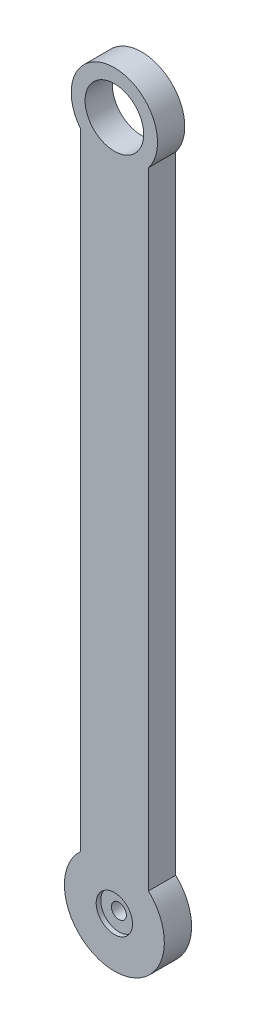
ISO-10303-21;
HEADER;
FILE_DESCRIPTION(('STEP AP214'),'2;1');
FILE_NAME('part.step','',(''),(''),'','','');
FILE_SCHEMA(('AUTOMOTIVE_DESIGN { 1 0 10303 214 1 1 1 1 }'));
ENDSEC;
DATA;
#1=APPLICATION_CONTEXT('core data for automotive mechanical design processes');
#2=APPLICATION_PROTOCOL_DEFINITION('international standard','automotive_design',2000,#1);
#3=PRODUCT_CONTEXT('',#1,'mechanical');
#4=PRODUCT('Part','Part','',(#3));
#5=PRODUCT_RELATED_PRODUCT_CATEGORY('part','',(#4));
#6=PRODUCT_DEFINITION_FORMATION('','',#4);
#7=PRODUCT_DEFINITION_CONTEXT('part definition',#1,'design');
#8=PRODUCT_DEFINITION('design','',#6,#7);
#9=PRODUCT_DEFINITION_SHAPE('','',#8);
#10=(LENGTH_UNIT() NAMED_UNIT(*) SI_UNIT(.MILLI.,.METRE.));
#11=(NAMED_UNIT(*) PLANE_ANGLE_UNIT() SI_UNIT($,.RADIAN.));
#12=(NAMED_UNIT(*) SI_UNIT($,.STERADIAN.) SOLID_ANGLE_UNIT());
#13=UNCERTAINTY_MEASURE_WITH_UNIT(LENGTH_MEASURE(1.E-05),#10,'distance_accuracy_value','');
#14=(GEOMETRIC_REPRESENTATION_CONTEXT(3) GLOBAL_UNCERTAINTY_ASSIGNED_CONTEXT((#13)) GLOBAL_UNIT_ASSIGNED_CONTEXT((#10,
#11,#12)) REPRESENTATION_CONTEXT('',''));
#15=CARTESIAN_POINT('',(0.,0.,0.));
#16=DIRECTION('',(0.,0.,1.));
#17=DIRECTION('',(1.,0.,0.));
#18=AXIS2_PLACEMENT_3D('',#15,#16,#17);
#19=CARTESIAN_POINT('',(7.5,7.5,10.));
#20=DIRECTION('',(0.,0.,-1.));
#21=DIRECTION('',(-1.,0.,0.));
#22=AXIS2_PLACEMENT_3D('',#19,#20,#21);
#23=CYLINDRICAL_SURFACE('',#22,1.65);
#24=CARTESIAN_POINT('',(7.5,7.5,0.));
#25=DIRECTION('',(0.,0.,-1.));
#26=DIRECTION('',(-1.,0.,0.));
#27=AXIS2_PLACEMENT_3D('',#24,#25,#26);
#28=CIRCLE('',#27,1.65);
#29=CARTESIAN_POINT('',(5.85,7.5,0.));
#30=VERTEX_POINT('',#29);
#31=EDGE_CURVE('E107',#30,#30,#28,.T.);
#32=ORIENTED_EDGE('',*,*,#31,.T.);
#33=EDGE_LOOP('',(#32));
#34=FACE_BOUND('',#33,.T.);
#35=CARTESIAN_POINT('',(7.5,7.5,5.));
#36=DIRECTION('',(0.,0.,1.));
#37=DIRECTION('',(1.,0.,0.));
#38=AXIS2_PLACEMENT_3D('',#35,#36,#37);
#39=CIRCLE('',#38,1.65);
#40=CARTESIAN_POINT('',(9.15,7.5,5.));
#41=VERTEX_POINT('',#40);
#42=EDGE_CURVE('E39',#41,#41,#39,.F.);
#43=ORIENTED_EDGE('',*,*,#42,.F.);
#44=EDGE_LOOP('',(#43));
#45=FACE_BOUND('',#44,.T.);
#46=ADVANCED_FACE('F35',(#34,#45),#23,.F.);
#47=CARTESIAN_POINT('',(0.,0.,6.));
#48=DIRECTION('',(1.,0.,0.));
#49=DIRECTION('',(0.,0.,-1.));
#50=AXIS2_PLACEMENT_3D('',#47,#48,#49);
#51=PLANE('',#50);
#52=DIRECTION('',(0.,-1.,0.));
#53=VECTOR('',#52,1.);
#54=CARTESIAN_POINT('',(0.,0.,6.));
#55=LINE('',#54,#53);
#56=CARTESIAN_POINT('',(0.,153.419048105155,6.));
#57=VERTEX_POINT('',#56);
#58=CARTESIAN_POINT('',(0.,15.5467384697156,6.));
#59=VERTEX_POINT('',#58);
#60=EDGE_CURVE('E44',#57,#59,#55,.T.);
#61=ORIENTED_EDGE('',*,*,#60,.F.);
#62=DIRECTION('',(0.,0.,1.));
#63=VECTOR('',#62,1.);
#64=CARTESIAN_POINT('',(0.,153.419048105155,0.));
#65=LINE('',#64,#63);
#66=CARTESIAN_POINT('',(0.,153.419048105155,0.));
#67=VERTEX_POINT('',#66);
#68=EDGE_CURVE('E78',#57,#67,#65,.F.);
#69=ORIENTED_EDGE('',*,*,#68,.T.);
#70=DIRECTION('',(0.,-1.,0.));
#71=VECTOR('',#70,1.);
#72=CARTESIAN_POINT('',(0.,0.,0.));
#73=LINE('',#72,#71);
#74=CARTESIAN_POINT('',(0.,15.5467384697156,0.));
#75=VERTEX_POINT('',#74);
#76=EDGE_CURVE('E89',#67,#75,#73,.T.);
#77=ORIENTED_EDGE('',*,*,#76,.T.);
#78=DIRECTION('',(0.,0.,1.));
#79=VECTOR('',#78,1.);
#80=CARTESIAN_POINT('',(0.,15.5467384697156,0.));
#81=LINE('',#80,#79);
#82=EDGE_CURVE('E96',#75,#59,#81,.T.);
#83=ORIENTED_EDGE('',*,*,#82,.T.);
#84=EDGE_LOOP('',(#61,#69,#77,#83));
#85=FACE_BOUND('',#84,.T.);
#86=ADVANCED_FACE('F37',(#85),#51,.F.);
#87=CARTESIAN_POINT('',(15.,0.,6.));
#88=DIRECTION('',(-1.,0.,0.));
#89=DIRECTION('',(0.,0.,1.));
#90=AXIS2_PLACEMENT_3D('',#87,#88,#89);
#91=PLANE('',#90);
#92=DIRECTION('',(0.,1.,0.));
#93=VECTOR('',#92,1.);
#94=CARTESIAN_POINT('',(15.,0.,0.));
#95=LINE('',#94,#93);
#96=CARTESIAN_POINT('',(15.,15.5467384697156,0.));
#97=VERTEX_POINT('',#96);
#98=CARTESIAN_POINT('',(15.,153.419048105155,0.));
#99=VERTEX_POINT('',#98);
#100=EDGE_CURVE('E95',#97,#99,#95,.T.);
#101=ORIENTED_EDGE('',*,*,#100,.T.);
#102=DIRECTION('',(0.,0.,1.));
#103=VECTOR('',#102,1.);
#104=CARTESIAN_POINT('',(15.,153.419048105155,0.));
#105=LINE('',#104,#103);
#106=CARTESIAN_POINT('',(15.,153.419048105155,6.));
#107=VERTEX_POINT('',#106);
#108=EDGE_CURVE('E80',#99,#107,#105,.T.);
#109=ORIENTED_EDGE('',*,*,#108,.T.);
#110=DIRECTION('',(0.,1.,0.));
#111=VECTOR('',#110,1.);
#112=CARTESIAN_POINT('',(15.,0.,6.));
#113=LINE('',#112,#111);
#114=CARTESIAN_POINT('',(15.,15.5467384697156,6.));
#115=VERTEX_POINT('',#114);
#116=EDGE_CURVE('E11',#115,#107,#113,.T.);
#117=ORIENTED_EDGE('',*,*,#116,.F.);
#118=DIRECTION('',(0.,0.,1.));
#119=VECTOR('',#118,1.);
#120=CARTESIAN_POINT('',(15.,15.5467384697156,0.));
#121=LINE('',#120,#119);
#122=EDGE_CURVE('E98',#115,#97,#121,.F.);
#123=ORIENTED_EDGE('',*,*,#122,.T.);
#124=EDGE_LOOP('',(#101,#109,#117,#123));
#125=FACE_BOUND('',#124,.T.);
#126=ADVANCED_FACE('F135',(#125),#91,.F.);
#127=CARTESIAN_POINT('',(0.,0.,6.));
#128=DIRECTION('',(0.,0.,-1.));
#129=DIRECTION('',(-1.,0.,0.));
#130=AXIS2_PLACEMENT_3D('',#127,#128,#129);
#131=PLANE('',#130);
#132=CARTESIAN_POINT('',(7.5,7.5,6.));
#133=DIRECTION('',(0.,0.,1.));
#134=DIRECTION('',(1.,0.,0.));
#135=AXIS2_PLACEMENT_3D('',#132,#133,#134);
#136=CIRCLE('',#135,4.);
#137=CARTESIAN_POINT('',(11.5,7.5,6.));
#138=VERTEX_POINT('',#137);
#139=EDGE_CURVE('E117',#138,#138,#136,.T.);
#140=ORIENTED_EDGE('',*,*,#139,.F.);
#141=EDGE_LOOP('',(#140));
#142=FACE_BOUND('',#141,.T.);
#143=CARTESIAN_POINT('',(7.5,159.25,6.));
#144=DIRECTION('',(0.,0.,-1.));
#145=DIRECTION('',(-1.,0.,0.));
#146=AXIS2_PLACEMENT_3D('',#143,#144,#145);
#147=CIRCLE('',#146,6.45000000000001);
#148=CARTESIAN_POINT('',(1.04999999999999,159.25,6.));
#149=VERTEX_POINT('',#148);
#150=EDGE_CURVE('E111',#149,#149,#147,.T.);
#151=ORIENTED_EDGE('',*,*,#150,.T.);
#152=EDGE_LOOP('',(#151));
#153=FACE_BOUND('',#152,.T.);
#154=CARTESIAN_POINT('',(7.5,159.25,6.));
#155=DIRECTION('',(0.,0.,1.));
#156=DIRECTION('',(1.,0.,0.));
#157=AXIS2_PLACEMENT_3D('',#154,#155,#156);
#158=CIRCLE('',#157,9.50000000000001);
#159=EDGE_CURVE('E85',#107,#57,#158,.T.);
#160=ORIENTED_EDGE('',*,*,#159,.T.);
#161=ORIENTED_EDGE('',*,*,#60,.T.);
#162=CARTESIAN_POINT('',(7.5,7.5,6.));
#163=DIRECTION('',(0.,0.,1.));
#164=DIRECTION('',(1.,0.,0.));
#165=AXIS2_PLACEMENT_3D('',#162,#163,#164);
#166=CIRCLE('',#165,11.);
#167=EDGE_CURVE('E51',#59,#115,#166,.T.);
#168=ORIENTED_EDGE('',*,*,#167,.T.);
#169=ORIENTED_EDGE('',*,*,#116,.T.);
#170=EDGE_LOOP('',(#160,#161,#168,#169));
#171=FACE_BOUND('',#170,.T.);
#172=ADVANCED_FACE('F146',(#142,#153,#171),#131,.F.);
#173=CARTESIAN_POINT('',(0.,0.,0.));
#174=DIRECTION('',(0.,0.,-1.));
#175=DIRECTION('',(-1.,0.,0.));
#176=AXIS2_PLACEMENT_3D('',#173,#174,#175);
#177=PLANE('',#176);
#178=CARTESIAN_POINT('',(7.5,159.25,0.));
#179=DIRECTION('',(0.,0.,-1.));
#180=DIRECTION('',(-1.,0.,0.));
#181=AXIS2_PLACEMENT_3D('',#178,#179,#180);
#182=CIRCLE('',#181,6.45000000000001);
#183=CARTESIAN_POINT('',(1.04999999999999,159.25,0.));
#184=VERTEX_POINT('',#183);
#185=EDGE_CURVE('E114',#184,#184,#182,.T.);
#186=ORIENTED_EDGE('',*,*,#185,.F.);
#187=EDGE_LOOP('',(#186));
#188=FACE_BOUND('',#187,.T.);
#189=ORIENTED_EDGE('',*,*,#31,.F.);
#190=EDGE_LOOP('',(#189));
#191=FACE_BOUND('',#190,.T.);
#192=ORIENTED_EDGE('',*,*,#76,.F.);
#193=CARTESIAN_POINT('',(7.5,159.25,0.));
#194=DIRECTION('',(0.,0.,1.));
#195=DIRECTION('',(1.,0.,0.));
#196=AXIS2_PLACEMENT_3D('',#193,#194,#195);
#197=CIRCLE('',#196,9.50000000000001);
#198=EDGE_CURVE('E75',#99,#67,#197,.T.);
#199=ORIENTED_EDGE('',*,*,#198,.F.);
#200=ORIENTED_EDGE('',*,*,#100,.F.);
#201=CARTESIAN_POINT('',(7.5,7.5,0.));
#202=DIRECTION('',(0.,0.,1.));
#203=DIRECTION('',(1.,0.,0.));
#204=AXIS2_PLACEMENT_3D('',#201,#202,#203);
#205=CIRCLE('',#204,11.);
#206=EDGE_CURVE('E94',#75,#97,#205,.T.);
#207=ORIENTED_EDGE('',*,*,#206,.F.);
#208=EDGE_LOOP('',(#192,#199,#200,#207));
#209=FACE_BOUND('',#208,.T.);
#210=ADVANCED_FACE('F93',(#188,#191,#209),#177,.T.);
#211=CARTESIAN_POINT('',(7.5,7.5,0.));
#212=DIRECTION('',(0.,0.,1.));
#213=DIRECTION('',(1.,0.,0.));
#214=AXIS2_PLACEMENT_3D('',#211,#212,#213);
#215=CYLINDRICAL_SURFACE('',#214,11.);
#216=ORIENTED_EDGE('',*,*,#82,.F.);
#217=ORIENTED_EDGE('',*,*,#206,.T.);
#218=ORIENTED_EDGE('',*,*,#122,.F.);
#219=ORIENTED_EDGE('',*,*,#167,.F.);
#220=EDGE_LOOP('',(#216,#217,#218,#219));
#221=FACE_BOUND('',#220,.T.);
#222=ADVANCED_FACE('F142',(#221),#215,.T.);
#223=CARTESIAN_POINT('',(7.5,159.25,0.));
#224=DIRECTION('',(0.,0.,1.));
#225=DIRECTION('',(1.,0.,0.));
#226=AXIS2_PLACEMENT_3D('',#223,#224,#225);
#227=CYLINDRICAL_SURFACE('',#226,9.50000000000001);
#228=ORIENTED_EDGE('',*,*,#68,.F.);
#229=ORIENTED_EDGE('',*,*,#159,.F.);
#230=ORIENTED_EDGE('',*,*,#108,.F.);
#231=ORIENTED_EDGE('',*,*,#198,.T.);
#232=EDGE_LOOP('',(#228,#229,#230,#231));
#233=FACE_BOUND('',#232,.T.);
#234=ADVANCED_FACE('F77',(#233),#227,.T.);
#235=CARTESIAN_POINT('',(7.5,159.25,10.));
#236=DIRECTION('',(0.,0.,-1.));
#237=DIRECTION('',(-1.,0.,0.));
#238=AXIS2_PLACEMENT_3D('',#235,#236,#237);
#239=CYLINDRICAL_SURFACE('',#238,6.45000000000001);
#240=ORIENTED_EDGE('',*,*,#185,.T.);
#241=EDGE_LOOP('',(#240));
#242=FACE_BOUND('',#241,.T.);
#243=ORIENTED_EDGE('',*,*,#150,.F.);
#244=EDGE_LOOP('',(#243));
#245=FACE_BOUND('',#244,.T.);
#246=ADVANCED_FACE('F138',(#242,#245),#239,.F.);
#247=CARTESIAN_POINT('',(7.5,7.5,5.));
#248=DIRECTION('',(0.,0.,1.));
#249=DIRECTION('',(1.,0.,0.));
#250=AXIS2_PLACEMENT_3D('',#247,#248,#249);
#251=PLANE('',#250);
#252=CARTESIAN_POINT('',(7.5,7.5,5.));
#253=DIRECTION('',(0.,0.,1.));
#254=DIRECTION('',(1.,0.,0.));
#255=AXIS2_PLACEMENT_3D('',#252,#253,#254);
#256=CIRCLE('',#255,4.);
#257=CARTESIAN_POINT('',(11.5,7.5,5.));
#258=VERTEX_POINT('',#257);
#259=EDGE_CURVE('E120',#258,#258,#256,.T.);
#260=ORIENTED_EDGE('',*,*,#259,.T.);
#261=EDGE_LOOP('',(#260));
#262=FACE_BOUND('',#261,.T.);
#263=ORIENTED_EDGE('',*,*,#42,.T.);
#264=EDGE_LOOP('',(#263));
#265=FACE_BOUND('',#264,.T.);
#266=ADVANCED_FACE('F127',(#262,#265),#251,.T.);
#267=CARTESIAN_POINT('',(7.5,7.5,5.));
#268=DIRECTION('',(0.,0.,1.));
#269=DIRECTION('',(1.,0.,0.));
#270=AXIS2_PLACEMENT_3D('',#267,#268,#269);
#271=CYLINDRICAL_SURFACE('',#270,4.);
#272=ORIENTED_EDGE('',*,*,#259,.F.);
#273=EDGE_LOOP('',(#272));
#274=FACE_BOUND('',#273,.T.);
#275=ORIENTED_EDGE('',*,*,#139,.T.);
#276=EDGE_LOOP('',(#275));
#277=FACE_BOUND('',#276,.T.);
#278=ADVANCED_FACE('F187',(#274,#277),#271,.F.);
#279=CLOSED_SHELL('',(#46,#86,#126,#172,#210,#222,#234,#246,#266,#278));
#280=MANIFOLD_SOLID_BREP('B2',#279);
#281=ADVANCED_BREP_SHAPE_REPRESENTATION('',(#18,#280),#14);
#282=SHAPE_DEFINITION_REPRESENTATION(#9,#281);
ENDSEC;
END-ISO-10303-21;
